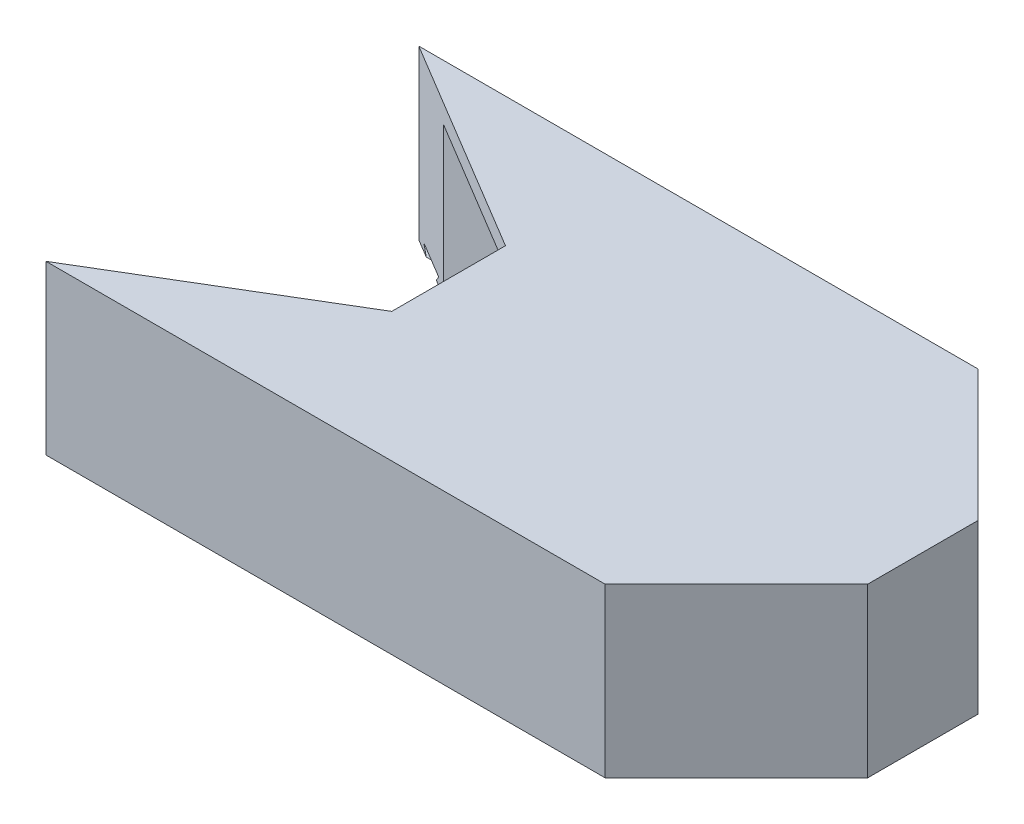
ISO-10303-21;
HEADER;
FILE_DESCRIPTION(('STEP AP214'),'2;1');
FILE_NAME('part.step','',(''),(''),'','','');
FILE_SCHEMA(('AUTOMOTIVE_DESIGN { 1 0 10303 214 1 1 1 1 }'));
ENDSEC;
DATA;
#1=APPLICATION_CONTEXT('core data for automotive mechanical design processes');
#2=APPLICATION_PROTOCOL_DEFINITION('international standard','automotive_design',2000,#1);
#3=PRODUCT_CONTEXT('',#1,'mechanical');
#4=PRODUCT('Part','Part','',(#3));
#5=PRODUCT_RELATED_PRODUCT_CATEGORY('part','',(#4));
#6=PRODUCT_DEFINITION_FORMATION('','',#4);
#7=PRODUCT_DEFINITION_CONTEXT('part definition',#1,'design');
#8=PRODUCT_DEFINITION('design','',#6,#7);
#9=PRODUCT_DEFINITION_SHAPE('','',#8);
#10=(LENGTH_UNIT() NAMED_UNIT(*) SI_UNIT(.MILLI.,.METRE.));
#11=(NAMED_UNIT(*) PLANE_ANGLE_UNIT() SI_UNIT($,.RADIAN.));
#12=(NAMED_UNIT(*) SI_UNIT($,.STERADIAN.) SOLID_ANGLE_UNIT());
#13=UNCERTAINTY_MEASURE_WITH_UNIT(LENGTH_MEASURE(1.E-05),#10,'distance_accuracy_value','');
#14=(GEOMETRIC_REPRESENTATION_CONTEXT(3) GLOBAL_UNCERTAINTY_ASSIGNED_CONTEXT((#13)) GLOBAL_UNIT_ASSIGNED_CONTEXT((#10,
#11,#12)) REPRESENTATION_CONTEXT('',''));
#15=CARTESIAN_POINT('',(0.,0.,0.));
#16=DIRECTION('',(0.,0.,1.));
#17=DIRECTION('',(1.,0.,0.));
#18=AXIS2_PLACEMENT_3D('',#15,#16,#17);
#19=CARTESIAN_POINT('',(0.,-45.,0.));
#20=DIRECTION('',(0.,1.,0.));
#21=DIRECTION('',(0.,0.,1.));
#22=AXIS2_PLACEMENT_3D('',#19,#20,#21);
#23=PLANE('',#22);
#24=DIRECTION('',(-1.,0.,0.));
#25=VECTOR('',#24,1.);
#26=CARTESIAN_POINT('',(146.,-45.,-47.));
#27=LINE('',#26,#25);
#28=CARTESIAN_POINT('',(146.,-45.,-47.));
#29=VERTEX_POINT('',#28);
#30=CARTESIAN_POINT('',(5.00719424460433,-45.,-47.));
#31=VERTEX_POINT('',#30);
#32=EDGE_CURVE('E232',#29,#31,#27,.T.);
#33=ORIENTED_EDGE('',*,*,#32,.T.);
#34=DIRECTION('',(0.857819002933426,0.,0.513951902619596));
#35=VECTOR('',#34,1.);
#36=CARTESIAN_POINT('',(22.043885433044,-45.,-36.7926720896849));
#37=LINE('',#36,#35);
#38=CARTESIAN_POINT('',(0.,-45.,-50.));
#39=VERTEX_POINT('',#38);
#40=EDGE_CURVE('E386',#39,#31,#37,.T.);
#41=ORIENTED_EDGE('',*,*,#40,.F.);
#42=DIRECTION('',(1.,0.,0.));
#43=VECTOR('',#42,1.);
#44=CARTESIAN_POINT('',(0.,-45.,-50.));
#45=LINE('',#44,#43);
#46=CARTESIAN_POINT('',(150.,-45.,-50.));
#47=VERTEX_POINT('',#46);
#48=EDGE_CURVE('E341',#39,#47,#45,.T.);
#49=ORIENTED_EDGE('',*,*,#48,.T.);
#50=DIRECTION('',(0.707106781186549,0.,0.707106781186546));
#51=VECTOR('',#50,1.);
#52=CARTESIAN_POINT('',(99.9999999999997,-45.,-100.));
#53=LINE('',#52,#51);
#54=CARTESIAN_POINT('',(185.196329111669,-45.,-14.8036708883307));
#55=VERTEX_POINT('',#54);
#56=EDGE_CURVE('E338',#47,#55,#53,.T.);
#57=ORIENTED_EDGE('',*,*,#56,.T.);
#58=DIRECTION('',(0.,0.,1.));
#59=VECTOR('',#58,1.);
#60=CARTESIAN_POINT('',(185.196329111669,-45.,0.));
#61=LINE('',#60,#59);
#62=CARTESIAN_POINT('',(185.196329111669,-45.,14.8036708883307));
#63=VERTEX_POINT('',#62);
#64=EDGE_CURVE('E335',#55,#63,#61,.T.);
#65=ORIENTED_EDGE('',*,*,#64,.T.);
#66=DIRECTION('',(-0.707106781186549,0.,0.707106781186546));
#67=VECTOR('',#66,1.);
#68=CARTESIAN_POINT('',(99.9999999999997,-45.,100.));
#69=LINE('',#68,#67);
#70=CARTESIAN_POINT('',(150.,-45.,50.));
#71=VERTEX_POINT('',#70);
#72=EDGE_CURVE('E331',#63,#71,#69,.T.);
#73=ORIENTED_EDGE('',*,*,#72,.T.);
#74=DIRECTION('',(-1.,0.,0.));
#75=VECTOR('',#74,1.);
#76=CARTESIAN_POINT('',(0.,-45.,50.));
#77=LINE('',#76,#75);
#78=CARTESIAN_POINT('',(0.,-45.,50.));
#79=VERTEX_POINT('',#78);
#80=EDGE_CURVE('E327',#71,#79,#77,.T.);
#81=ORIENTED_EDGE('',*,*,#80,.T.);
#82=DIRECTION('',(0.857819002933426,0.,-0.513951902619596));
#83=VECTOR('',#82,1.);
#84=CARTESIAN_POINT('',(22.043885433044,-45.,36.7926720896849));
#85=LINE('',#84,#83);
#86=CARTESIAN_POINT('',(5.00719424460432,-45.,47.));
#87=VERTEX_POINT('',#86);
#88=EDGE_CURVE('E382',#79,#87,#85,.T.);
#89=ORIENTED_EDGE('',*,*,#88,.T.);
#90=DIRECTION('',(-1.,0.,0.));
#91=VECTOR('',#90,1.);
#92=CARTESIAN_POINT('',(146.,-45.,47.));
#93=LINE('',#92,#91);
#94=CARTESIAN_POINT('',(146.,-45.,47.));
#95=VERTEX_POINT('',#94);
#96=EDGE_CURVE('E70',#95,#87,#93,.T.);
#97=ORIENTED_EDGE('',*,*,#96,.F.);
#98=DIRECTION('',(0.,0.,-1.));
#99=VECTOR('',#98,1.);
#100=CARTESIAN_POINT('',(146.,-45.,0.));
#101=LINE('',#100,#99);
#102=CARTESIAN_POINT('',(146.,-45.,43.));
#103=VERTEX_POINT('',#102);
#104=EDGE_CURVE('E227',#95,#103,#101,.T.);
#105=ORIENTED_EDGE('',*,*,#104,.T.);
#106=DIRECTION('',(-1.,0.,0.));
#107=VECTOR('',#106,1.);
#108=CARTESIAN_POINT('',(146.,-45.,43.));
#109=LINE('',#108,#107);
#110=CARTESIAN_POINT('',(11.6834532374101,-45.,43.));
#111=VERTEX_POINT('',#110);
#112=EDGE_CURVE('E242',#103,#111,#109,.T.);
#113=ORIENTED_EDGE('',*,*,#112,.T.);
#114=CARTESIAN_POINT('',(16.6906474820144,-45.,40.));
#115=VERTEX_POINT('',#114);
#116=EDGE_CURVE('E363',#111,#115,#85,.T.);
#117=ORIENTED_EDGE('',*,*,#116,.T.);
#118=DIRECTION('',(1.,0.,0.));
#119=VECTOR('',#118,1.);
#120=CARTESIAN_POINT('',(0.,-45.,40.));
#121=LINE('',#120,#119);
#122=CARTESIAN_POINT('',(145.857864376269,-45.,40.));
#123=VERTEX_POINT('',#122);
#124=EDGE_CURVE('E301',#115,#123,#121,.T.);
#125=ORIENTED_EDGE('',*,*,#124,.T.);
#126=DIRECTION('',(0.707106781186548,0.,-0.707106781186547));
#127=VECTOR('',#126,1.);
#128=CARTESIAN_POINT('',(92.9289321881345,-45.,92.9289321881345));
#129=LINE('',#128,#127);
#130=CARTESIAN_POINT('',(175.196329111669,-45.,10.6615352645996));
#131=VERTEX_POINT('',#130);
#132=EDGE_CURVE('E394',#123,#131,#129,.T.);
#133=ORIENTED_EDGE('',*,*,#132,.T.);
#134=DIRECTION('',(0.,0.,-1.));
#135=VECTOR('',#134,1.);
#136=CARTESIAN_POINT('',(175.196329111669,-45.,0.));
#137=LINE('',#136,#135);
#138=CARTESIAN_POINT('',(175.196329111669,-45.,-10.6615352645998));
#139=VERTEX_POINT('',#138);
#140=EDGE_CURVE('E398',#131,#139,#137,.T.);
#141=ORIENTED_EDGE('',*,*,#140,.T.);
#142=DIRECTION('',(-0.707106781186548,0.,-0.707106781186548));
#143=VECTOR('',#142,1.);
#144=CARTESIAN_POINT('',(92.9289321881346,-45.,-92.9289321881346));
#145=LINE('',#144,#143);
#146=CARTESIAN_POINT('',(145.857864376269,-45.,-40.));
#147=VERTEX_POINT('',#146);
#148=EDGE_CURVE('E402',#139,#147,#145,.T.);
#149=ORIENTED_EDGE('',*,*,#148,.T.);
#150=DIRECTION('',(-1.,0.,0.));
#151=VECTOR('',#150,1.);
#152=CARTESIAN_POINT('',(0.,-45.,-40.));
#153=LINE('',#152,#151);
#154=CARTESIAN_POINT('',(16.6906474820144,-45.,-40.));
#155=VERTEX_POINT('',#154);
#156=EDGE_CURVE('E305',#147,#155,#153,.T.);
#157=ORIENTED_EDGE('',*,*,#156,.T.);
#158=CARTESIAN_POINT('',(11.6834532374101,-45.,-43.));
#159=VERTEX_POINT('',#158);
#160=EDGE_CURVE('E217',#159,#155,#37,.T.);
#161=ORIENTED_EDGE('',*,*,#160,.F.);
#162=DIRECTION('',(-1.,0.,0.));
#163=VECTOR('',#162,1.);
#164=CARTESIAN_POINT('',(146.,-45.,-43.));
#165=LINE('',#164,#163);
#166=CARTESIAN_POINT('',(146.,-45.,-43.));
#167=VERTEX_POINT('',#166);
#168=EDGE_CURVE('E62',#167,#159,#165,.T.);
#169=ORIENTED_EDGE('',*,*,#168,.F.);
#170=DIRECTION('',(0.,0.,1.));
#171=VECTOR('',#170,1.);
#172=CARTESIAN_POINT('',(146.,-45.,0.));
#173=LINE('',#172,#171);
#174=EDGE_CURVE('E205',#29,#167,#173,.T.);
#175=ORIENTED_EDGE('',*,*,#174,.F.);
#176=EDGE_LOOP('',(#33,#41,#49,#57,#65,#73,#81,#89,#97,#105,#113,#117,#125,#133,#141,#149,#157,
#161,#169,#175));
#177=FACE_BOUND('',#176,.T.);
#178=ADVANCED_FACE('F46',(#177),#23,.F.);
#179=CARTESIAN_POINT('',(22.043885433044,-87.,-36.7926720896849));
#180=DIRECTION('',(-0.513951902619596,0.,0.857819002933426));
#181=DIRECTION('',(0.857819002933426,0.,0.513951902619596));
#182=AXIS2_PLACEMENT_3D('',#179,#180,#181);
#183=PLANE('',#182);
#184=ORIENTED_EDGE('',*,*,#40,.T.);
#185=DIRECTION('',(-0.598166656616928,0.716768666118561,-0.35838433305928));
#186=VECTOR('',#185,1.);
#187=CARTESIAN_POINT('',(31.2985395103338,-76.5042844132448,-31.2478577933776));
#188=LINE('',#187,#186);
#189=CARTESIAN_POINT('',(3.33812949640289,-43.,-48.));
#190=VERTEX_POINT('',#189);
#191=EDGE_CURVE('E11',#31,#190,#188,.T.);
#192=ORIENTED_EDGE('',*,*,#191,.T.);
#193=DIRECTION('',(-0.857819002933426,0.,-0.513951902619596));
#194=VECTOR('',#193,1.);
#195=CARTESIAN_POINT('',(22.043885433044,-43.,-36.7926720896849));
#196=LINE('',#195,#194);
#197=CARTESIAN_POINT('',(13.3525179856116,-43.,-42.));
#198=VERTEX_POINT('',#197);
#199=EDGE_CURVE('E55',#198,#190,#196,.T.);
#200=ORIENTED_EDGE('',*,*,#199,.F.);
#201=DIRECTION('',(0.598166656616928,0.716768666118561,0.35838433305928));
#202=VECTOR('',#201,1.);
#203=CARTESIAN_POINT('',(-1.28624134973974,-60.5412719621882,-50.7706359810941));
#204=LINE('',#203,#202);
#205=EDGE_CURVE('E415',#159,#198,#204,.T.);
#206=ORIENTED_EDGE('',*,*,#205,.F.);
#207=ORIENTED_EDGE('',*,*,#160,.T.);
#208=DIRECTION('',(0.,1.,0.));
#209=VECTOR('',#208,1.);
#210=CARTESIAN_POINT('',(16.6906474820144,-45.000012,-40.));
#211=LINE('',#210,#209);
#212=CARTESIAN_POINT('',(16.6906474820144,-5.,-40.));
#213=VERTEX_POINT('',#212);
#214=EDGE_CURVE('E285',#155,#213,#211,.T.);
#215=ORIENTED_EDGE('',*,*,#214,.T.);
#216=DIRECTION('',(-0.857819002933426,0.,-0.513951902619596));
#217=VECTOR('',#216,1.);
#218=CARTESIAN_POINT('',(22.043885433044,-5.,-36.7926720896849));
#219=LINE('',#218,#217);
#220=CARTESIAN_POINT('',(58.,-5.,-15.25));
#221=VERTEX_POINT('',#220);
#222=EDGE_CURVE('E281',#221,#213,#219,.T.);
#223=ORIENTED_EDGE('',*,*,#222,.F.);
#224=DIRECTION('',(0.,1.,0.));
#225=VECTOR('',#224,1.);
#226=CARTESIAN_POINT('',(58.,-87.,-15.25));
#227=LINE('',#226,#225);
#228=CARTESIAN_POINT('',(58.,0.,-15.25));
#229=VERTEX_POINT('',#228);
#230=EDGE_CURVE('E321',#221,#229,#227,.T.);
#231=ORIENTED_EDGE('',*,*,#230,.T.);
#232=DIRECTION('',(0.857819002933426,0.,0.513951902619596));
#233=VECTOR('',#232,1.);
#234=CARTESIAN_POINT('',(22.043885433044,0.,-36.7926720896849));
#235=LINE('',#234,#233);
#236=CARTESIAN_POINT('',(0.,0.,-50.));
#237=VERTEX_POINT('',#236);
#238=EDGE_CURVE('E308',#237,#229,#235,.T.);
#239=ORIENTED_EDGE('',*,*,#238,.F.);
#240=DIRECTION('',(0.,1.,0.));
#241=VECTOR('',#240,1.);
#242=CARTESIAN_POINT('',(0.,-45.,-50.));
#243=LINE('',#242,#241);
#244=EDGE_CURVE('E359',#39,#237,#243,.T.);
#245=ORIENTED_EDGE('',*,*,#244,.F.);
#246=EDGE_LOOP('',(#184,#192,#200,#206,#207,#215,#223,#231,#239,#245));
#247=FACE_BOUND('',#246,.T.);
#248=ADVANCED_FACE('F427',(#247),#183,.T.);
#249=CARTESIAN_POINT('',(22.043885433044,-87.,36.7926720896849));
#250=DIRECTION('',(0.513951902619596,0.,0.857819002933426));
#251=DIRECTION('',(0.857819002933426,0.,-0.513951902619596));
#252=AXIS2_PLACEMENT_3D('',#249,#250,#251);
#253=PLANE('',#252);
#254=DIRECTION('',(-0.598166656616928,-0.716768666118561,0.35838433305928));
#255=VECTOR('',#254,1.);
#256=CARTESIAN_POINT('',(-1.28624134973974,-60.5412719621882,50.7706359810941));
#257=LINE('',#256,#255);
#258=CARTESIAN_POINT('',(13.3525179856115,-43.,42.));
#259=VERTEX_POINT('',#258);
#260=EDGE_CURVE('E412',#259,#111,#257,.T.);
#261=ORIENTED_EDGE('',*,*,#260,.F.);
#262=DIRECTION('',(0.857819002933426,0.,-0.513951902619596));
#263=VECTOR('',#262,1.);
#264=CARTESIAN_POINT('',(22.043885433044,-43.,36.7926720896849));
#265=LINE('',#264,#263);
#266=CARTESIAN_POINT('',(3.33812949640289,-43.,48.));
#267=VERTEX_POINT('',#266);
#268=EDGE_CURVE('E409',#267,#259,#265,.T.);
#269=ORIENTED_EDGE('',*,*,#268,.F.);
#270=DIRECTION('',(0.598166656616928,-0.716768666118561,-0.35838433305928));
#271=VECTOR('',#270,1.);
#272=CARTESIAN_POINT('',(31.2985395103338,-76.5042844132448,31.2478577933776));
#273=LINE('',#272,#271);
#274=EDGE_CURVE('E406',#267,#87,#273,.T.);
#275=ORIENTED_EDGE('',*,*,#274,.T.);
#276=ORIENTED_EDGE('',*,*,#88,.F.);
#277=DIRECTION('',(0.,1.,0.));
#278=VECTOR('',#277,1.);
#279=CARTESIAN_POINT('',(0.,-45.,50.));
#280=LINE('',#279,#278);
#281=CARTESIAN_POINT('',(0.,0.,50.));
#282=VERTEX_POINT('',#281);
#283=EDGE_CURVE('E344',#79,#282,#280,.T.);
#284=ORIENTED_EDGE('',*,*,#283,.T.);
#285=DIRECTION('',(0.857819002933426,0.,-0.513951902619596));
#286=VECTOR('',#285,1.);
#287=CARTESIAN_POINT('',(22.043885433044,0.,36.7926720896849));
#288=LINE('',#287,#286);
#289=CARTESIAN_POINT('',(58.,0.,15.25));
#290=VERTEX_POINT('',#289);
#291=EDGE_CURVE('E312',#282,#290,#288,.T.);
#292=ORIENTED_EDGE('',*,*,#291,.T.);
#293=DIRECTION('',(0.,1.,0.));
#294=VECTOR('',#293,1.);
#295=CARTESIAN_POINT('',(58.,-87.,15.25));
#296=LINE('',#295,#294);
#297=CARTESIAN_POINT('',(58.,-5.,15.25));
#298=VERTEX_POINT('',#297);
#299=EDGE_CURVE('E320',#298,#290,#296,.T.);
#300=ORIENTED_EDGE('',*,*,#299,.F.);
#301=DIRECTION('',(0.857819002933426,0.,-0.513951902619596));
#302=VECTOR('',#301,1.);
#303=CARTESIAN_POINT('',(22.043885433044,-5.,36.7926720896849));
#304=LINE('',#303,#302);
#305=CARTESIAN_POINT('',(16.6906474820144,-4.99999999999999,40.));
#306=VERTEX_POINT('',#305);
#307=EDGE_CURVE('E275',#306,#298,#304,.T.);
#308=ORIENTED_EDGE('',*,*,#307,.F.);
#309=DIRECTION('',(0.,-1.,0.));
#310=VECTOR('',#309,1.);
#311=CARTESIAN_POINT('',(16.6906474820144,-87.,40.));
#312=LINE('',#311,#310);
#313=EDGE_CURVE('E390',#306,#115,#312,.T.);
#314=ORIENTED_EDGE('',*,*,#313,.T.);
#315=ORIENTED_EDGE('',*,*,#116,.F.);
#316=EDGE_LOOP('',(#261,#269,#275,#276,#284,#292,#300,#308,#314,#315));
#317=FACE_BOUND('',#316,.T.);
#318=ADVANCED_FACE('F455',(#317),#253,.F.);
#319=CARTESIAN_POINT('',(58.,-87.,0.));
#320=DIRECTION('',(1.,0.,0.));
#321=DIRECTION('',(0.,0.,-1.));
#322=AXIS2_PLACEMENT_3D('',#319,#320,#321);
#323=PLANE('',#322);
#324=DIRECTION('',(0.,0.,-1.));
#325=VECTOR('',#324,1.);
#326=CARTESIAN_POINT('',(58.,-5.,0.));
#327=LINE('',#326,#325);
#328=EDGE_CURVE('E278',#298,#221,#327,.T.);
#329=ORIENTED_EDGE('',*,*,#328,.F.);
#330=ORIENTED_EDGE('',*,*,#299,.T.);
#331=DIRECTION('',(0.,0.,-1.));
#332=VECTOR('',#331,1.);
#333=CARTESIAN_POINT('',(58.,0.,0.));
#334=LINE('',#333,#332);
#335=EDGE_CURVE('E316',#290,#229,#334,.T.);
#336=ORIENTED_EDGE('',*,*,#335,.T.);
#337=ORIENTED_EDGE('',*,*,#230,.F.);
#338=EDGE_LOOP('',(#329,#330,#336,#337));
#339=FACE_BOUND('',#338,.T.);
#340=ADVANCED_FACE('F498',(#339),#323,.F.);
#341=CARTESIAN_POINT('',(0.,0.,0.));
#342=DIRECTION('',(0.,1.,0.));
#343=DIRECTION('',(0.,0.,1.));
#344=AXIS2_PLACEMENT_3D('',#341,#342,#343);
#345=PLANE('',#344);
#346=DIRECTION('',(1.,0.,0.));
#347=VECTOR('',#346,1.);
#348=CARTESIAN_POINT('',(0.,0.,-50.));
#349=LINE('',#348,#347);
#350=CARTESIAN_POINT('',(150.,0.,-50.));
#351=VERTEX_POINT('',#350);
#352=EDGE_CURVE('E332',#237,#351,#349,.T.);
#353=ORIENTED_EDGE('',*,*,#352,.F.);
#354=ORIENTED_EDGE('',*,*,#238,.T.);
#355=ORIENTED_EDGE('',*,*,#335,.F.);
#356=ORIENTED_EDGE('',*,*,#291,.F.);
#357=DIRECTION('',(-1.,0.,0.));
#358=VECTOR('',#357,1.);
#359=CARTESIAN_POINT('',(0.,0.,50.));
#360=LINE('',#359,#358);
#361=CARTESIAN_POINT('',(150.,0.,50.));
#362=VERTEX_POINT('',#361);
#363=EDGE_CURVE('E324',#362,#282,#360,.T.);
#364=ORIENTED_EDGE('',*,*,#363,.F.);
#365=DIRECTION('',(-0.707106781186549,0.,0.707106781186546));
#366=VECTOR('',#365,1.);
#367=CARTESIAN_POINT('',(99.9999999999997,0.,100.));
#368=LINE('',#367,#366);
#369=CARTESIAN_POINT('',(185.196329111669,0.,14.8036708883307));
#370=VERTEX_POINT('',#369);
#371=EDGE_CURVE('E348',#370,#362,#368,.T.);
#372=ORIENTED_EDGE('',*,*,#371,.F.);
#373=DIRECTION('',(0.,0.,1.));
#374=VECTOR('',#373,1.);
#375=CARTESIAN_POINT('',(185.196329111669,0.,0.));
#376=LINE('',#375,#374);
#377=CARTESIAN_POINT('',(185.196329111669,0.,-14.8036708883307));
#378=VERTEX_POINT('',#377);
#379=EDGE_CURVE('E351',#378,#370,#376,.T.);
#380=ORIENTED_EDGE('',*,*,#379,.F.);
#381=DIRECTION('',(0.707106781186549,0.,0.707106781186546));
#382=VECTOR('',#381,1.);
#383=CARTESIAN_POINT('',(99.9999999999997,0.,-100.));
#384=LINE('',#383,#382);
#385=EDGE_CURVE('E354',#351,#378,#384,.T.);
#386=ORIENTED_EDGE('',*,*,#385,.F.);
#387=EDGE_LOOP('',(#353,#354,#355,#356,#364,#372,#380,#386));
#388=FACE_BOUND('',#387,.T.);
#389=ADVANCED_FACE('F502',(#388),#345,.T.);
#390=CARTESIAN_POINT('',(0.,-45.,-50.));
#391=DIRECTION('',(0.,0.,1.));
#392=DIRECTION('',(1.,0.,0.));
#393=AXIS2_PLACEMENT_3D('',#390,#391,#392);
#394=PLANE('',#393);
#395=ORIENTED_EDGE('',*,*,#352,.T.);
#396=DIRECTION('',(0.,1.,0.));
#397=VECTOR('',#396,1.);
#398=CARTESIAN_POINT('',(150.,-45.,-50.));
#399=LINE('',#398,#397);
#400=EDGE_CURVE('E364',#47,#351,#399,.T.);
#401=ORIENTED_EDGE('',*,*,#400,.F.);
#402=ORIENTED_EDGE('',*,*,#48,.F.);
#403=ORIENTED_EDGE('',*,*,#244,.T.);
#404=EDGE_LOOP('',(#395,#401,#402,#403));
#405=FACE_BOUND('',#404,.T.);
#406=ADVANCED_FACE('F432',(#405),#394,.F.);
#407=CARTESIAN_POINT('',(99.9999999999997,-45.,-100.));
#408=DIRECTION('',(-0.707106781186546,0.,0.707106781186549));
#409=DIRECTION('',(0.707106781186549,0.,0.707106781186546));
#410=AXIS2_PLACEMENT_3D('',#407,#408,#409);
#411=PLANE('',#410);
#412=ORIENTED_EDGE('',*,*,#385,.T.);
#413=DIRECTION('',(0.,1.,0.));
#414=VECTOR('',#413,1.);
#415=CARTESIAN_POINT('',(185.196329111669,-45.,-14.8036708883307));
#416=LINE('',#415,#414);
#417=EDGE_CURVE('E368',#55,#378,#416,.T.);
#418=ORIENTED_EDGE('',*,*,#417,.F.);
#419=ORIENTED_EDGE('',*,*,#56,.F.);
#420=ORIENTED_EDGE('',*,*,#400,.T.);
#421=EDGE_LOOP('',(#412,#418,#419,#420));
#422=FACE_BOUND('',#421,.T.);
#423=ADVANCED_FACE('F438',(#422),#411,.F.);
#424=CARTESIAN_POINT('',(185.196329111669,-45.,0.));
#425=DIRECTION('',(-1.,0.,0.));
#426=DIRECTION('',(0.,0.,1.));
#427=AXIS2_PLACEMENT_3D('',#424,#425,#426);
#428=PLANE('',#427);
#429=ORIENTED_EDGE('',*,*,#379,.T.);
#430=DIRECTION('',(0.,1.,0.));
#431=VECTOR('',#430,1.);
#432=CARTESIAN_POINT('',(185.196329111669,-45.,14.8036708883307));
#433=LINE('',#432,#431);
#434=EDGE_CURVE('E372',#63,#370,#433,.T.);
#435=ORIENTED_EDGE('',*,*,#434,.F.);
#436=ORIENTED_EDGE('',*,*,#64,.F.);
#437=ORIENTED_EDGE('',*,*,#417,.T.);
#438=EDGE_LOOP('',(#429,#435,#436,#437));
#439=FACE_BOUND('',#438,.T.);
#440=ADVANCED_FACE('F444',(#439),#428,.F.);
#441=CARTESIAN_POINT('',(99.9999999999997,-45.,100.));
#442=DIRECTION('',(-0.707106781186546,0.,-0.707106781186549));
#443=DIRECTION('',(-0.707106781186549,0.,0.707106781186546));
#444=AXIS2_PLACEMENT_3D('',#441,#442,#443);
#445=PLANE('',#444);
#446=ORIENTED_EDGE('',*,*,#371,.T.);
#447=DIRECTION('',(0.,1.,0.));
#448=VECTOR('',#447,1.);
#449=CARTESIAN_POINT('',(150.,-45.,50.));
#450=LINE('',#449,#448);
#451=EDGE_CURVE('E376',#71,#362,#450,.T.);
#452=ORIENTED_EDGE('',*,*,#451,.F.);
#453=ORIENTED_EDGE('',*,*,#72,.F.);
#454=ORIENTED_EDGE('',*,*,#434,.T.);
#455=EDGE_LOOP('',(#446,#452,#453,#454));
#456=FACE_BOUND('',#455,.T.);
#457=ADVANCED_FACE('F448',(#456),#445,.F.);
#458=CARTESIAN_POINT('',(0.,-45.,50.));
#459=DIRECTION('',(0.,0.,-1.));
#460=DIRECTION('',(-1.,0.,0.));
#461=AXIS2_PLACEMENT_3D('',#458,#459,#460);
#462=PLANE('',#461);
#463=ORIENTED_EDGE('',*,*,#363,.T.);
#464=ORIENTED_EDGE('',*,*,#283,.F.);
#465=ORIENTED_EDGE('',*,*,#80,.F.);
#466=ORIENTED_EDGE('',*,*,#451,.T.);
#467=EDGE_LOOP('',(#463,#464,#465,#466));
#468=FACE_BOUND('',#467,.T.);
#469=ADVANCED_FACE('F48',(#468),#462,.F.);
#470=CARTESIAN_POINT('',(92.9289321881346,-45.000012,-92.9289321881346));
#471=DIRECTION('',(0.707106781186548,0.,-0.707106781186548));
#472=DIRECTION('',(-0.707106781186548,0.,-0.707106781186548));
#473=AXIS2_PLACEMENT_3D('',#470,#471,#472);
#474=PLANE('',#473);
#475=DIRECTION('',(0.,1.,0.));
#476=VECTOR('',#475,1.);
#477=CARTESIAN_POINT('',(175.196329111669,-45.000012,-10.6615352645998));
#478=LINE('',#477,#476);
#479=CARTESIAN_POINT('',(175.196329111669,-5.,-10.6615352645998));
#480=VERTEX_POINT('',#479);
#481=EDGE_CURVE('E295',#139,#480,#478,.T.);
#482=ORIENTED_EDGE('',*,*,#481,.T.);
#483=DIRECTION('',(-0.707106781186548,0.,-0.707106781186548));
#484=VECTOR('',#483,1.);
#485=CARTESIAN_POINT('',(92.9289321881346,-5.,-92.9289321881346));
#486=LINE('',#485,#484);
#487=CARTESIAN_POINT('',(145.857864376269,-5.,-40.));
#488=VERTEX_POINT('',#487);
#489=EDGE_CURVE('E259',#480,#488,#486,.T.);
#490=ORIENTED_EDGE('',*,*,#489,.T.);
#491=DIRECTION('',(0.,1.,0.));
#492=VECTOR('',#491,1.);
#493=CARTESIAN_POINT('',(145.857864376269,-45.000012,-40.));
#494=LINE('',#493,#492);
#495=EDGE_CURVE('E298',#147,#488,#494,.T.);
#496=ORIENTED_EDGE('',*,*,#495,.F.);
#497=ORIENTED_EDGE('',*,*,#148,.F.);
#498=EDGE_LOOP('',(#482,#490,#496,#497));
#499=FACE_BOUND('',#498,.T.);
#500=ADVANCED_FACE('F486',(#499),#474,.F.);
#501=CARTESIAN_POINT('',(175.196329111669,-45.000012,0.));
#502=DIRECTION('',(1.,0.,0.));
#503=DIRECTION('',(0.,0.,-1.));
#504=AXIS2_PLACEMENT_3D('',#501,#502,#503);
#505=PLANE('',#504);
#506=DIRECTION('',(0.,1.,0.));
#507=VECTOR('',#506,1.);
#508=CARTESIAN_POINT('',(175.196329111669,-45.000012,10.6615352645996));
#509=LINE('',#508,#507);
#510=CARTESIAN_POINT('',(175.196329111669,-5.,10.6615352645996));
#511=VERTEX_POINT('',#510);
#512=EDGE_CURVE('E292',#131,#511,#509,.T.);
#513=ORIENTED_EDGE('',*,*,#512,.T.);
#514=DIRECTION('',(0.,0.,-1.));
#515=VECTOR('',#514,1.);
#516=CARTESIAN_POINT('',(175.196329111669,-5.,0.));
#517=LINE('',#516,#515);
#518=EDGE_CURVE('E263',#511,#480,#517,.T.);
#519=ORIENTED_EDGE('',*,*,#518,.T.);
#520=ORIENTED_EDGE('',*,*,#481,.F.);
#521=ORIENTED_EDGE('',*,*,#140,.F.);
#522=EDGE_LOOP('',(#513,#519,#520,#521));
#523=FACE_BOUND('',#522,.T.);
#524=ADVANCED_FACE('F488',(#523),#505,.F.);
#525=CARTESIAN_POINT('',(92.9289321881345,-45.000012,92.9289321881345));
#526=DIRECTION('',(0.707106781186547,0.,0.707106781186548));
#527=DIRECTION('',(0.707106781186548,0.,-0.707106781186547));
#528=AXIS2_PLACEMENT_3D('',#525,#526,#527);
#529=PLANE('',#528);
#530=DIRECTION('',(0.,1.,0.));
#531=VECTOR('',#530,1.);
#532=CARTESIAN_POINT('',(145.857864376269,-45.000012,40.));
#533=LINE('',#532,#531);
#534=CARTESIAN_POINT('',(145.857864376269,-5.,40.));
#535=VERTEX_POINT('',#534);
#536=EDGE_CURVE('E289',#123,#535,#533,.T.);
#537=ORIENTED_EDGE('',*,*,#536,.T.);
#538=DIRECTION('',(0.707106781186548,0.,-0.707106781186547));
#539=VECTOR('',#538,1.);
#540=CARTESIAN_POINT('',(92.9289321881345,-5.,92.9289321881345));
#541=LINE('',#540,#539);
#542=EDGE_CURVE('E267',#535,#511,#541,.T.);
#543=ORIENTED_EDGE('',*,*,#542,.T.);
#544=ORIENTED_EDGE('',*,*,#512,.F.);
#545=ORIENTED_EDGE('',*,*,#132,.F.);
#546=EDGE_LOOP('',(#537,#543,#544,#545));
#547=FACE_BOUND('',#546,.T.);
#548=ADVANCED_FACE('F507',(#547),#529,.F.);
#549=CARTESIAN_POINT('',(0.,-45.000012,-40.));
#550=DIRECTION('',(0.,0.,-1.));
#551=DIRECTION('',(-1.,0.,0.));
#552=AXIS2_PLACEMENT_3D('',#549,#550,#551);
#553=PLANE('',#552);
#554=ORIENTED_EDGE('',*,*,#495,.T.);
#555=DIRECTION('',(-1.,0.,0.));
#556=VECTOR('',#555,1.);
#557=CARTESIAN_POINT('',(0.,-5.,-40.));
#558=LINE('',#557,#556);
#559=EDGE_CURVE('E246',#488,#213,#558,.T.);
#560=ORIENTED_EDGE('',*,*,#559,.T.);
#561=ORIENTED_EDGE('',*,*,#214,.F.);
#562=ORIENTED_EDGE('',*,*,#156,.F.);
#563=EDGE_LOOP('',(#554,#560,#561,#562));
#564=FACE_BOUND('',#563,.T.);
#565=ADVANCED_FACE('F481',(#564),#553,.F.);
#566=CARTESIAN_POINT('',(0.,-45.000012,40.));
#567=DIRECTION('',(0.,0.,1.));
#568=DIRECTION('',(1.,0.,0.));
#569=AXIS2_PLACEMENT_3D('',#566,#567,#568);
#570=PLANE('',#569);
#571=ORIENTED_EDGE('',*,*,#313,.F.);
#572=DIRECTION('',(1.,0.,0.));
#573=VECTOR('',#572,1.);
#574=CARTESIAN_POINT('',(0.,-5.,40.));
#575=LINE('',#574,#573);
#576=EDGE_CURVE('E271',#306,#535,#575,.T.);
#577=ORIENTED_EDGE('',*,*,#576,.T.);
#578=ORIENTED_EDGE('',*,*,#536,.F.);
#579=ORIENTED_EDGE('',*,*,#124,.F.);
#580=EDGE_LOOP('',(#571,#577,#578,#579));
#581=FACE_BOUND('',#580,.T.);
#582=ADVANCED_FACE('F505',(#581),#570,.F.);
#583=CARTESIAN_POINT('',(0.,-5.,0.));
#584=DIRECTION('',(0.,-1.,0.));
#585=DIRECTION('',(0.,0.,-1.));
#586=AXIS2_PLACEMENT_3D('',#583,#584,#585);
#587=PLANE('',#586);
#588=ORIENTED_EDGE('',*,*,#559,.F.);
#589=ORIENTED_EDGE('',*,*,#489,.F.);
#590=ORIENTED_EDGE('',*,*,#518,.F.);
#591=ORIENTED_EDGE('',*,*,#542,.F.);
#592=ORIENTED_EDGE('',*,*,#576,.F.);
#593=ORIENTED_EDGE('',*,*,#307,.T.);
#594=ORIENTED_EDGE('',*,*,#328,.T.);
#595=ORIENTED_EDGE('',*,*,#222,.T.);
#596=EDGE_LOOP('',(#588,#589,#590,#591,#592,#593,#594,#595));
#597=FACE_BOUND('',#596,.T.);
#598=ADVANCED_FACE('F494',(#597),#587,.T.);
#599=CARTESIAN_POINT('',(146.,8.2,16.4));
#600=DIRECTION('',(0.,0.447213595499958,0.894427190999916));
#601=DIRECTION('',(0.,-0.894427190999916,0.447213595499958));
#602=AXIS2_PLACEMENT_3D('',#599,#600,#601);
#603=PLANE('',#602);
#604=ORIENTED_EDGE('',*,*,#260,.T.);
#605=ORIENTED_EDGE('',*,*,#112,.F.);
#606=DIRECTION('',(0.,0.894427190999916,-0.447213595499958));
#607=VECTOR('',#606,1.);
#608=CARTESIAN_POINT('',(146.,8.2,16.4));
#609=LINE('',#608,#607);
#610=CARTESIAN_POINT('',(146.,-43.,42.));
#611=VERTEX_POINT('',#610);
#612=EDGE_CURVE('E239',#103,#611,#609,.T.);
#613=ORIENTED_EDGE('',*,*,#612,.T.);
#614=DIRECTION('',(-1.,0.,0.));
#615=VECTOR('',#614,1.);
#616=CARTESIAN_POINT('',(146.,-43.,42.));
#617=LINE('',#616,#615);
#618=EDGE_CURVE('E247',#611,#259,#617,.T.);
#619=ORIENTED_EDGE('',*,*,#618,.T.);
#620=EDGE_LOOP('',(#604,#605,#613,#619));
#621=FACE_BOUND('',#620,.T.);
#622=ADVANCED_FACE('F557',(#621),#603,.T.);
#623=CARTESIAN_POINT('',(146.,-43.,0.));
#624=DIRECTION('',(0.,-1.,0.));
#625=DIRECTION('',(0.,0.,-1.));
#626=AXIS2_PLACEMENT_3D('',#623,#624,#625);
#627=PLANE('',#626);
#628=ORIENTED_EDGE('',*,*,#268,.T.);
#629=ORIENTED_EDGE('',*,*,#618,.F.);
#630=DIRECTION('',(0.,0.,1.));
#631=VECTOR('',#630,1.);
#632=CARTESIAN_POINT('',(146.,-43.,0.));
#633=LINE('',#632,#631);
#634=CARTESIAN_POINT('',(146.,-43.,48.));
#635=VERTEX_POINT('',#634);
#636=EDGE_CURVE('E236',#611,#635,#633,.T.);
#637=ORIENTED_EDGE('',*,*,#636,.T.);
#638=DIRECTION('',(-1.,0.,0.));
#639=VECTOR('',#638,1.);
#640=CARTESIAN_POINT('',(146.,-43.,48.));
#641=LINE('',#640,#639);
#642=EDGE_CURVE('E251',#635,#267,#641,.T.);
#643=ORIENTED_EDGE('',*,*,#642,.T.);
#644=EDGE_LOOP('',(#628,#629,#637,#643));
#645=FACE_BOUND('',#644,.T.);
#646=ADVANCED_FACE('F461',(#645),#627,.T.);
#647=CARTESIAN_POINT('',(146.,-27.8,55.6));
#648=DIRECTION('',(0.,-0.447213595499958,0.894427190999916));
#649=DIRECTION('',(0.,-0.894427190999916,-0.447213595499958));
#650=AXIS2_PLACEMENT_3D('',#647,#648,#649);
#651=PLANE('',#650);
#652=ORIENTED_EDGE('',*,*,#642,.F.);
#653=DIRECTION('',(0.,0.894427190999916,0.447213595499958));
#654=VECTOR('',#653,1.);
#655=CARTESIAN_POINT('',(146.,-27.8,55.6));
#656=LINE('',#655,#654);
#657=EDGE_CURVE('E231',#95,#635,#656,.T.);
#658=ORIENTED_EDGE('',*,*,#657,.F.);
#659=ORIENTED_EDGE('',*,*,#96,.T.);
#660=ORIENTED_EDGE('',*,*,#274,.F.);
#661=EDGE_LOOP('',(#652,#658,#659,#660));
#662=FACE_BOUND('',#661,.T.);
#663=ADVANCED_FACE('F459',(#662),#651,.F.);
#664=CARTESIAN_POINT('',(146.,0.,0.));
#665=DIRECTION('',(-1.,0.,0.));
#666=DIRECTION('',(0.,0.,1.));
#667=AXIS2_PLACEMENT_3D('',#664,#665,#666);
#668=PLANE('',#667);
#669=ORIENTED_EDGE('',*,*,#104,.F.);
#670=ORIENTED_EDGE('',*,*,#657,.T.);
#671=ORIENTED_EDGE('',*,*,#636,.F.);
#672=ORIENTED_EDGE('',*,*,#612,.F.);
#673=EDGE_LOOP('',(#669,#670,#671,#672));
#674=FACE_BOUND('',#673,.T.);
#675=ADVANCED_FACE('F465',(#674),#668,.T.);
#676=CARTESIAN_POINT('',(146.,-27.8,-55.6));
#677=DIRECTION('',(0.,0.447213595499958,0.894427190999916));
#678=DIRECTION('',(0.,-0.894427190999916,0.447213595499958));
#679=AXIS2_PLACEMENT_3D('',#676,#677,#678);
#680=PLANE('',#679);
#681=ORIENTED_EDGE('',*,*,#32,.F.);
#682=DIRECTION('',(0.,0.894427190999916,-0.447213595499958));
#683=VECTOR('',#682,1.);
#684=CARTESIAN_POINT('',(146.,-27.8,-55.6));
#685=LINE('',#684,#683);
#686=CARTESIAN_POINT('',(146.,-43.,-48.));
#687=VERTEX_POINT('',#686);
#688=EDGE_CURVE('E210',#29,#687,#685,.T.);
#689=ORIENTED_EDGE('',*,*,#688,.T.);
#690=DIRECTION('',(-1.,0.,0.));
#691=VECTOR('',#690,1.);
#692=CARTESIAN_POINT('',(146.,-43.,-48.));
#693=LINE('',#692,#691);
#694=EDGE_CURVE('E222',#687,#190,#693,.T.);
#695=ORIENTED_EDGE('',*,*,#694,.T.);
#696=ORIENTED_EDGE('',*,*,#191,.F.);
#697=EDGE_LOOP('',(#681,#689,#695,#696));
#698=FACE_BOUND('',#697,.T.);
#699=ADVANCED_FACE('F425',(#698),#680,.T.);
#700=CARTESIAN_POINT('',(146.,-43.,0.));
#701=DIRECTION('',(0.,1.,0.));
#702=DIRECTION('',(0.,0.,1.));
#703=AXIS2_PLACEMENT_3D('',#700,#701,#702);
#704=PLANE('',#703);
#705=ORIENTED_EDGE('',*,*,#199,.T.);
#706=ORIENTED_EDGE('',*,*,#694,.F.);
#707=DIRECTION('',(0.,0.,-1.));
#708=VECTOR('',#707,1.);
#709=CARTESIAN_POINT('',(146.,-43.,0.));
#710=LINE('',#709,#708);
#711=CARTESIAN_POINT('',(146.,-43.,-42.));
#712=VERTEX_POINT('',#711);
#713=EDGE_CURVE('E204',#712,#687,#710,.T.);
#714=ORIENTED_EDGE('',*,*,#713,.F.);
#715=DIRECTION('',(-1.,0.,0.));
#716=VECTOR('',#715,1.);
#717=CARTESIAN_POINT('',(146.,-43.,-42.));
#718=LINE('',#717,#716);
#719=EDGE_CURVE('E199',#712,#198,#718,.T.);
#720=ORIENTED_EDGE('',*,*,#719,.T.);
#721=EDGE_LOOP('',(#705,#706,#714,#720));
#722=FACE_BOUND('',#721,.T.);
#723=ADVANCED_FACE('F422',(#722),#704,.F.);
#724=CARTESIAN_POINT('',(146.,8.2,-16.4));
#725=DIRECTION('',(0.,-0.447213595499958,0.894427190999916));
#726=DIRECTION('',(0.,-0.894427190999916,-0.447213595499958));
#727=AXIS2_PLACEMENT_3D('',#724,#725,#726);
#728=PLANE('',#727);
#729=ORIENTED_EDGE('',*,*,#205,.T.);
#730=ORIENTED_EDGE('',*,*,#719,.F.);
#731=DIRECTION('',(0.,0.894427190999916,0.447213595499958));
#732=VECTOR('',#731,1.);
#733=CARTESIAN_POINT('',(146.,8.2,-16.4));
#734=LINE('',#733,#732);
#735=EDGE_CURVE('E195',#167,#712,#734,.T.);
#736=ORIENTED_EDGE('',*,*,#735,.F.);
#737=ORIENTED_EDGE('',*,*,#168,.T.);
#738=EDGE_LOOP('',(#729,#730,#736,#737));
#739=FACE_BOUND('',#738,.T.);
#740=ADVANCED_FACE('F197',(#739),#728,.F.);
#741=CARTESIAN_POINT('',(146.,0.,0.));
#742=DIRECTION('',(-1.,0.,0.));
#743=DIRECTION('',(0.,0.,-1.));
#744=AXIS2_PLACEMENT_3D('',#741,#742,#743);
#745=PLANE('',#744);
#746=ORIENTED_EDGE('',*,*,#174,.T.);
#747=ORIENTED_EDGE('',*,*,#735,.T.);
#748=ORIENTED_EDGE('',*,*,#713,.T.);
#749=ORIENTED_EDGE('',*,*,#688,.F.);
#750=EDGE_LOOP('',(#746,#747,#748,#749));
#751=FACE_BOUND('',#750,.T.);
#752=ADVANCED_FACE('F209',(#751),#745,.T.);
#753=CLOSED_SHELL('',(#178,#248,#318,#340,#389,#406,#423,#440,#457,#469,#500,#524,#548,#565,
#582,#598,#622,#646,#663,#675,#699,#723,#740,#752));
#754=MANIFOLD_SOLID_BREP('B2',#753);
#755=ADVANCED_BREP_SHAPE_REPRESENTATION('',(#18,#754),#14);
#756=SHAPE_DEFINITION_REPRESENTATION(#9,#755);
ENDSEC;
END-ISO-10303-21;
